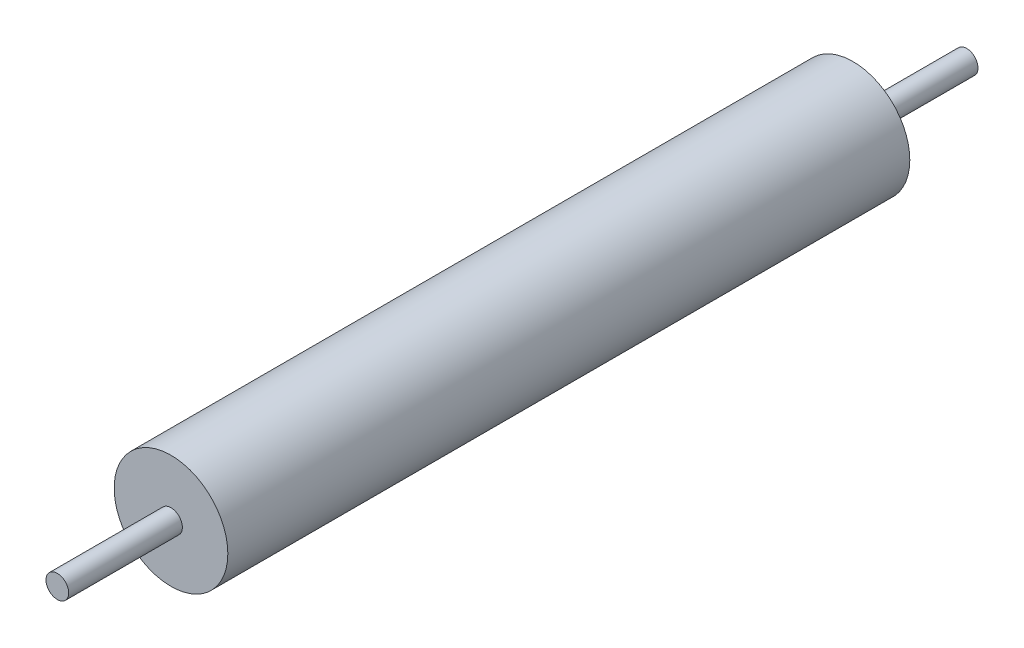
ISO-10303-21;
HEADER;
FILE_DESCRIPTION(('STEP AP214'),'2;1');
FILE_NAME('part.step','',(''),(''),'','','');
FILE_SCHEMA(('AUTOMOTIVE_DESIGN { 1 0 10303 214 1 1 1 1 }'));
ENDSEC;
DATA;
#1=APPLICATION_CONTEXT('core data for automotive mechanical design processes');
#2=APPLICATION_PROTOCOL_DEFINITION('international standard','automotive_design',2000,#1);
#3=PRODUCT_CONTEXT('',#1,'mechanical');
#4=PRODUCT('Part','Part','',(#3));
#5=PRODUCT_RELATED_PRODUCT_CATEGORY('part','',(#4));
#6=PRODUCT_DEFINITION_FORMATION('','',#4);
#7=PRODUCT_DEFINITION_CONTEXT('part definition',#1,'design');
#8=PRODUCT_DEFINITION('design','',#6,#7);
#9=PRODUCT_DEFINITION_SHAPE('','',#8);
#10=(LENGTH_UNIT() NAMED_UNIT(*) SI_UNIT(.MILLI.,.METRE.));
#11=(NAMED_UNIT(*) PLANE_ANGLE_UNIT() SI_UNIT($,.RADIAN.));
#12=(NAMED_UNIT(*) SI_UNIT($,.STERADIAN.) SOLID_ANGLE_UNIT());
#13=UNCERTAINTY_MEASURE_WITH_UNIT(LENGTH_MEASURE(1.E-05),#10,'distance_accuracy_value','');
#14=(GEOMETRIC_REPRESENTATION_CONTEXT(3) GLOBAL_UNCERTAINTY_ASSIGNED_CONTEXT((#13)) GLOBAL_UNIT_ASSIGNED_CONTEXT((#10,
#11,#12)) REPRESENTATION_CONTEXT('',''));
#15=CARTESIAN_POINT('',(0.,0.,0.));
#16=DIRECTION('',(0.,0.,1.));
#17=DIRECTION('',(1.,0.,0.));
#18=AXIS2_PLACEMENT_3D('',#15,#16,#17);
#19=CARTESIAN_POINT('',(0.,0.,100.));
#20=DIRECTION('',(0.,0.,-1.));
#21=DIRECTION('',(-1.,0.,0.));
#22=AXIS2_PLACEMENT_3D('',#19,#20,#21);
#23=CYLINDRICAL_SURFACE('',#22,2.5);
#24=CARTESIAN_POINT('',(0.,0.,75.));
#25=DIRECTION('',(0.,0.,1.));
#26=DIRECTION('',(1.,0.,0.));
#27=AXIS2_PLACEMENT_3D('',#24,#25,#26);
#28=CIRCLE('',#27,2.5);
#29=CARTESIAN_POINT('',(2.5,0.,75.));
#30=VERTEX_POINT('',#29);
#31=EDGE_CURVE('E42',#30,#30,#28,.T.);
#32=ORIENTED_EDGE('',*,*,#31,.T.);
#33=EDGE_LOOP('',(#32));
#34=FACE_BOUND('',#33,.T.);
#35=CARTESIAN_POINT('',(0.,0.,100.));
#36=DIRECTION('',(0.,0.,1.));
#37=DIRECTION('',(1.,0.,0.));
#38=AXIS2_PLACEMENT_3D('',#35,#36,#37);
#39=CIRCLE('',#38,2.5);
#40=CARTESIAN_POINT('',(2.5,0.,100.));
#41=VERTEX_POINT('',#40);
#42=EDGE_CURVE('E46',#41,#41,#39,.T.);
#43=ORIENTED_EDGE('',*,*,#42,.F.);
#44=EDGE_LOOP('',(#43));
#45=FACE_BOUND('',#44,.T.);
#46=ADVANCED_FACE('F39',(#34,#45),#23,.T.);
#47=CARTESIAN_POINT('',(0.,0.,100.));
#48=DIRECTION('',(0.,0.,1.));
#49=DIRECTION('',(1.,0.,0.));
#50=AXIS2_PLACEMENT_3D('',#47,#48,#49);
#51=PLANE('',#50);
#52=ORIENTED_EDGE('',*,*,#42,.T.);
#53=EDGE_LOOP('',(#52));
#54=FACE_BOUND('',#53,.T.);
#55=ADVANCED_FACE('F78',(#54),#51,.T.);
#56=CARTESIAN_POINT('',(0.,0.,75.));
#57=DIRECTION('',(0.,0.,-1.));
#58=DIRECTION('',(-1.,0.,0.));
#59=AXIS2_PLACEMENT_3D('',#56,#57,#58);
#60=CYLINDRICAL_SURFACE('',#59,12.5);
#61=CARTESIAN_POINT('',(0.,0.,75.));
#62=DIRECTION('',(0.,0.,1.));
#63=DIRECTION('',(1.,0.,0.));
#64=AXIS2_PLACEMENT_3D('',#61,#62,#63);
#65=CIRCLE('',#64,12.5);
#66=CARTESIAN_POINT('',(12.5,0.,75.));
#67=VERTEX_POINT('',#66);
#68=EDGE_CURVE('E58',#67,#67,#65,.T.);
#69=ORIENTED_EDGE('',*,*,#68,.F.);
#70=EDGE_LOOP('',(#69));
#71=FACE_BOUND('',#70,.T.);
#72=CARTESIAN_POINT('',(0.,0.,-75.));
#73=DIRECTION('',(0.,0.,1.));
#74=DIRECTION('',(1.,0.,0.));
#75=AXIS2_PLACEMENT_3D('',#72,#73,#74);
#76=CIRCLE('',#75,12.5);
#77=CARTESIAN_POINT('',(12.5,0.,-75.));
#78=VERTEX_POINT('',#77);
#79=EDGE_CURVE('E55',#78,#78,#76,.T.);
#80=ORIENTED_EDGE('',*,*,#79,.T.);
#81=EDGE_LOOP('',(#80));
#82=FACE_BOUND('',#81,.T.);
#83=ADVANCED_FACE('F70',(#71,#82),#60,.T.);
#84=CARTESIAN_POINT('',(0.,0.,75.));
#85=DIRECTION('',(0.,0.,1.));
#86=DIRECTION('',(1.,0.,0.));
#87=AXIS2_PLACEMENT_3D('',#84,#85,#86);
#88=PLANE('',#87);
#89=ORIENTED_EDGE('',*,*,#31,.F.);
#90=EDGE_LOOP('',(#89));
#91=FACE_BOUND('',#90,.T.);
#92=ORIENTED_EDGE('',*,*,#68,.T.);
#93=EDGE_LOOP('',(#92));
#94=FACE_BOUND('',#93,.T.);
#95=ADVANCED_FACE('F67',(#91,#94),#88,.T.);
#96=CARTESIAN_POINT('',(0.,0.,-75.));
#97=DIRECTION('',(0.,0.,1.));
#98=DIRECTION('',(1.,0.,0.));
#99=AXIS2_PLACEMENT_3D('',#96,#97,#98);
#100=PLANE('',#99);
#101=CARTESIAN_POINT('',(0.,0.,-75.));
#102=DIRECTION('',(0.,0.,1.));
#103=DIRECTION('',(1.,0.,0.));
#104=AXIS2_PLACEMENT_3D('',#101,#102,#103);
#105=CIRCLE('',#104,2.5);
#106=CARTESIAN_POINT('',(2.5,0.,-75.));
#107=VERTEX_POINT('',#106);
#108=EDGE_CURVE('E10',#107,#107,#105,.T.);
#109=ORIENTED_EDGE('',*,*,#108,.T.);
#110=EDGE_LOOP('',(#109));
#111=FACE_BOUND('',#110,.T.);
#112=ORIENTED_EDGE('',*,*,#79,.F.);
#113=EDGE_LOOP('',(#112));
#114=FACE_BOUND('',#113,.T.);
#115=ADVANCED_FACE('F69',(#111,#114),#100,.F.);
#116=CARTESIAN_POINT('',(0.,0.,-100.));
#117=DIRECTION('',(0.,0.,1.));
#118=DIRECTION('',(1.,0.,0.));
#119=AXIS2_PLACEMENT_3D('',#116,#117,#118);
#120=PLANE('',#119);
#121=CARTESIAN_POINT('',(0.,0.,-100.));
#122=DIRECTION('',(0.,0.,1.));
#123=DIRECTION('',(1.,0.,0.));
#124=AXIS2_PLACEMENT_3D('',#121,#122,#123);
#125=CIRCLE('',#124,2.5);
#126=CARTESIAN_POINT('',(2.5,0.,-100.));
#127=VERTEX_POINT('',#126);
#128=EDGE_CURVE('E50',#127,#127,#125,.T.);
#129=ORIENTED_EDGE('',*,*,#128,.F.);
#130=EDGE_LOOP('',(#129));
#131=FACE_BOUND('',#130,.T.);
#132=ADVANCED_FACE('F76',(#131),#120,.F.);
#133=ORIENTED_EDGE('',*,*,#128,.T.);
#134=EDGE_LOOP('',(#133));
#135=FACE_BOUND('',#134,.T.);
#136=ORIENTED_EDGE('',*,*,#108,.F.);
#137=EDGE_LOOP('',(#136));
#138=FACE_BOUND('',#137,.T.);
#139=ADVANCED_FACE('F82',(#135,#138),#23,.T.);
#140=CLOSED_SHELL('',(#46,#55,#83,#95,#115,#132,#139));
#141=MANIFOLD_SOLID_BREP('B2',#140);
#142=ADVANCED_BREP_SHAPE_REPRESENTATION('',(#18,#141),#14);
#143=SHAPE_DEFINITION_REPRESENTATION(#9,#142);
ENDSEC;
END-ISO-10303-21;
